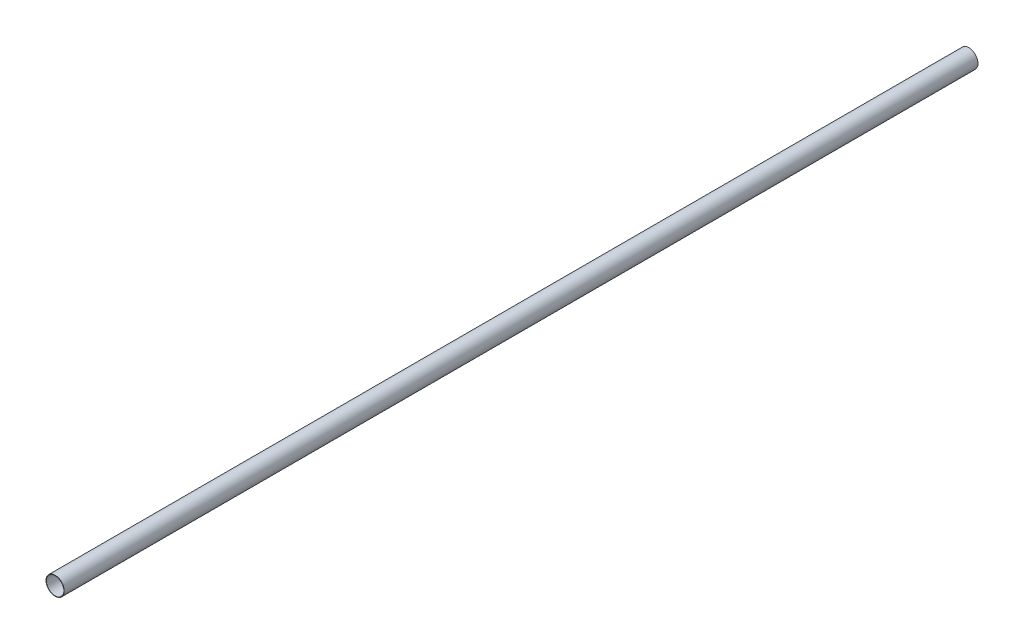
ISO-10303-21;
HEADER;
FILE_DESCRIPTION(('STEP AP214'),'2;1');
FILE_NAME('part.step','',(''),(''),'','','');
FILE_SCHEMA(('AUTOMOTIVE_DESIGN { 1 0 10303 214 1 1 1 1 }'));
ENDSEC;
DATA;
#1=APPLICATION_CONTEXT('core data for automotive mechanical design processes');
#2=APPLICATION_PROTOCOL_DEFINITION('international standard','automotive_design',2000,#1);
#3=PRODUCT_CONTEXT('',#1,'mechanical');
#4=PRODUCT('Part','Part','',(#3));
#5=PRODUCT_RELATED_PRODUCT_CATEGORY('part','',(#4));
#6=PRODUCT_DEFINITION_FORMATION('','',#4);
#7=PRODUCT_DEFINITION_CONTEXT('part definition',#1,'design');
#8=PRODUCT_DEFINITION('design','',#6,#7);
#9=PRODUCT_DEFINITION_SHAPE('','',#8);
#10=(LENGTH_UNIT() NAMED_UNIT(*) SI_UNIT(.MILLI.,.METRE.));
#11=(NAMED_UNIT(*) PLANE_ANGLE_UNIT() SI_UNIT($,.RADIAN.));
#12=(NAMED_UNIT(*) SI_UNIT($,.STERADIAN.) SOLID_ANGLE_UNIT());
#13=UNCERTAINTY_MEASURE_WITH_UNIT(LENGTH_MEASURE(1.E-05),#10,'distance_accuracy_value','');
#14=(GEOMETRIC_REPRESENTATION_CONTEXT(3) GLOBAL_UNCERTAINTY_ASSIGNED_CONTEXT((#13)) GLOBAL_UNIT_ASSIGNED_CONTEXT((#10,
#11,#12)) REPRESENTATION_CONTEXT('',''));
#15=CARTESIAN_POINT('',(0.,0.,0.));
#16=DIRECTION('',(0.,0.,1.));
#17=DIRECTION('',(1.,0.,0.));
#18=AXIS2_PLACEMENT_3D('',#15,#16,#17);
#19=CARTESIAN_POINT('',(0.,0.,1500.));
#20=DIRECTION('',(0.,0.,1.));
#21=DIRECTION('',(1.,0.,0.));
#22=AXIS2_PLACEMENT_3D('',#19,#20,#21);
#23=PLANE('',#22);
#24=CARTESIAN_POINT('',(0.,0.,1500.));
#25=DIRECTION('',(0.,0.,1.));
#26=DIRECTION('',(1.,0.,0.));
#27=AXIS2_PLACEMENT_3D('',#24,#25,#26);
#28=CIRCLE('',#27,15.);
#29=CARTESIAN_POINT('',(15.,0.,1500.));
#30=VERTEX_POINT('',#29);
#31=EDGE_CURVE('E10',#30,#30,#28,.T.);
#32=ORIENTED_EDGE('',*,*,#31,.T.);
#33=EDGE_LOOP('',(#32));
#34=FACE_BOUND('',#33,.T.);
#35=CARTESIAN_POINT('',(0.,0.,1500.));
#36=DIRECTION('',(0.,0.,1.));
#37=DIRECTION('',(1.,0.,0.));
#38=AXIS2_PLACEMENT_3D('',#35,#36,#37);
#39=CIRCLE('',#38,14.35);
#40=CARTESIAN_POINT('',(14.35,0.,1500.));
#41=VERTEX_POINT('',#40);
#42=EDGE_CURVE('E44',#41,#41,#39,.T.);
#43=ORIENTED_EDGE('',*,*,#42,.F.);
#44=EDGE_LOOP('',(#43));
#45=FACE_BOUND('',#44,.T.);
#46=ADVANCED_FACE('F33',(#34,#45),#23,.T.);
#47=CARTESIAN_POINT('',(0.,0.,0.));
#48=DIRECTION('',(0.,0.,1.));
#49=DIRECTION('',(1.,0.,0.));
#50=AXIS2_PLACEMENT_3D('',#47,#48,#49);
#51=PLANE('',#50);
#52=CARTESIAN_POINT('',(0.,0.,0.));
#53=DIRECTION('',(0.,0.,1.));
#54=DIRECTION('',(1.,0.,0.));
#55=AXIS2_PLACEMENT_3D('',#52,#53,#54);
#56=CIRCLE('',#55,15.);
#57=CARTESIAN_POINT('',(15.,0.,0.));
#58=VERTEX_POINT('',#57);
#59=EDGE_CURVE('E37',#58,#58,#56,.T.);
#60=ORIENTED_EDGE('',*,*,#59,.F.);
#61=EDGE_LOOP('',(#60));
#62=FACE_BOUND('',#61,.T.);
#63=CARTESIAN_POINT('',(0.,0.,0.));
#64=DIRECTION('',(0.,0.,1.));
#65=DIRECTION('',(1.,0.,0.));
#66=AXIS2_PLACEMENT_3D('',#63,#64,#65);
#67=CIRCLE('',#66,14.35);
#68=CARTESIAN_POINT('',(14.35,0.,0.));
#69=VERTEX_POINT('',#68);
#70=EDGE_CURVE('E46',#69,#69,#67,.T.);
#71=ORIENTED_EDGE('',*,*,#70,.T.);
#72=EDGE_LOOP('',(#71));
#73=FACE_BOUND('',#72,.T.);
#74=ADVANCED_FACE('F56',(#62,#73),#51,.F.);
#75=CARTESIAN_POINT('',(0.,0.,1500.));
#76=DIRECTION('',(0.,0.,-1.));
#77=DIRECTION('',(-1.,0.,0.));
#78=AXIS2_PLACEMENT_3D('',#75,#76,#77);
#79=CYLINDRICAL_SURFACE('',#78,15.);
#80=ORIENTED_EDGE('',*,*,#31,.F.);
#81=EDGE_LOOP('',(#80));
#82=FACE_BOUND('',#81,.T.);
#83=ORIENTED_EDGE('',*,*,#59,.T.);
#84=EDGE_LOOP('',(#83));
#85=FACE_BOUND('',#84,.T.);
#86=ADVANCED_FACE('F35',(#82,#85),#79,.T.);
#87=CARTESIAN_POINT('',(0.,0.,1500.));
#88=DIRECTION('',(0.,0.,-1.));
#89=DIRECTION('',(-1.,0.,0.));
#90=AXIS2_PLACEMENT_3D('',#87,#88,#89);
#91=CYLINDRICAL_SURFACE('',#90,14.35);
#92=ORIENTED_EDGE('',*,*,#42,.T.);
#93=EDGE_LOOP('',(#92));
#94=FACE_BOUND('',#93,.T.);
#95=ORIENTED_EDGE('',*,*,#70,.F.);
#96=EDGE_LOOP('',(#95));
#97=FACE_BOUND('',#96,.T.);
#98=ADVANCED_FACE('F52',(#94,#97),#91,.F.);
#99=CLOSED_SHELL('',(#46,#74,#86,#98));
#100=MANIFOLD_SOLID_BREP('B2',#99);
#101=ADVANCED_BREP_SHAPE_REPRESENTATION('',(#18,#100),#14);
#102=SHAPE_DEFINITION_REPRESENTATION(#9,#101);
ENDSEC;
END-ISO-10303-21;
